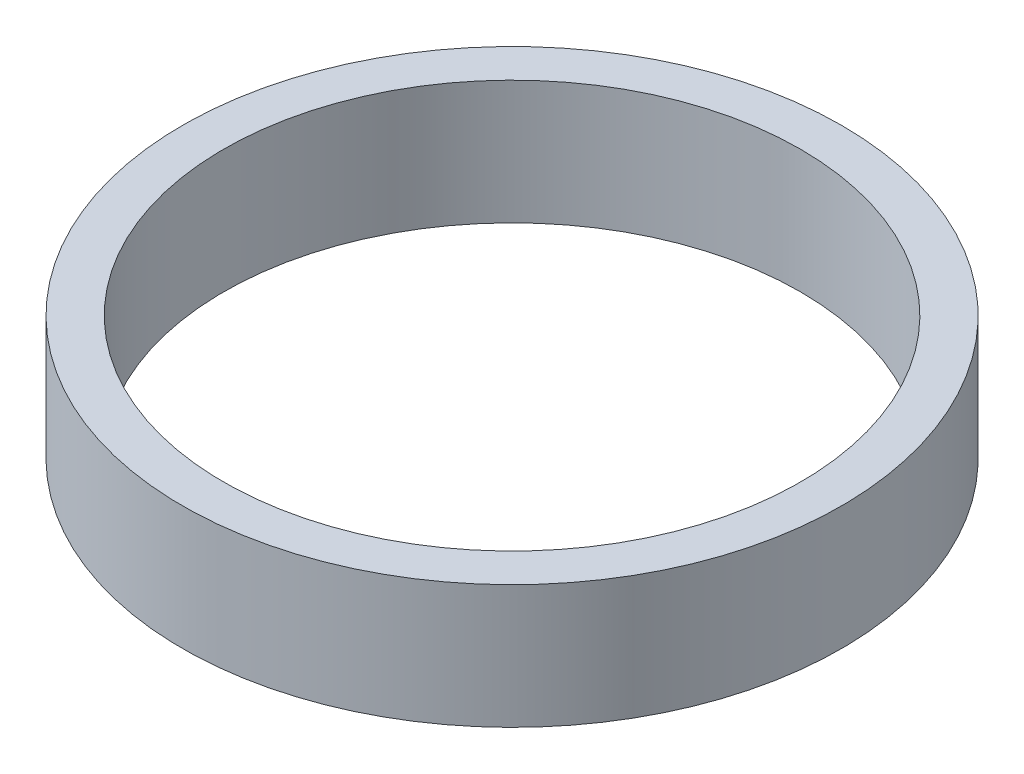
ISO-10303-21;
HEADER;
FILE_DESCRIPTION(('STEP AP214'),'2;1');
FILE_NAME('part.step','',(''),(''),'','','');
FILE_SCHEMA(('AUTOMOTIVE_DESIGN { 1 0 10303 214 1 1 1 1 }'));
ENDSEC;
DATA;
#1=APPLICATION_CONTEXT('core data for automotive mechanical design processes');
#2=APPLICATION_PROTOCOL_DEFINITION('international standard','automotive_design',2000,#1);
#3=PRODUCT_CONTEXT('',#1,'mechanical');
#4=PRODUCT('Part','Part','',(#3));
#5=PRODUCT_RELATED_PRODUCT_CATEGORY('part','',(#4));
#6=PRODUCT_DEFINITION_FORMATION('','',#4);
#7=PRODUCT_DEFINITION_CONTEXT('part definition',#1,'design');
#8=PRODUCT_DEFINITION('design','',#6,#7);
#9=PRODUCT_DEFINITION_SHAPE('','',#8);
#10=(LENGTH_UNIT() NAMED_UNIT(*) SI_UNIT(.MILLI.,.METRE.));
#11=(NAMED_UNIT(*) PLANE_ANGLE_UNIT() SI_UNIT($,.RADIAN.));
#12=(NAMED_UNIT(*) SI_UNIT($,.STERADIAN.) SOLID_ANGLE_UNIT());
#13=UNCERTAINTY_MEASURE_WITH_UNIT(LENGTH_MEASURE(1.E-05),#10,'distance_accuracy_value','');
#14=(GEOMETRIC_REPRESENTATION_CONTEXT(3) GLOBAL_UNCERTAINTY_ASSIGNED_CONTEXT((#13)) GLOBAL_UNIT_ASSIGNED_CONTEXT((#10,
#11,#12)) REPRESENTATION_CONTEXT('',''));
#15=CARTESIAN_POINT('',(0.,0.,0.));
#16=DIRECTION('',(0.,0.,1.));
#17=DIRECTION('',(1.,0.,0.));
#18=AXIS2_PLACEMENT_3D('',#15,#16,#17);
#19=CARTESIAN_POINT('',(0.,7.62,0.));
#20=DIRECTION('',(0.,1.,0.));
#21=DIRECTION('',(0.,0.,1.));
#22=AXIS2_PLACEMENT_3D('',#19,#20,#21);
#23=PLANE('',#22);
#24=CARTESIAN_POINT('',(0.,7.62,0.));
#25=DIRECTION('',(0.,1.,0.));
#26=DIRECTION('',(0.,0.,1.));
#27=AXIS2_PLACEMENT_3D('',#24,#25,#26);
#28=CIRCLE('',#27,20.32);
#29=CARTESIAN_POINT('',(0.,7.62,-20.32));
#30=VERTEX_POINT('',#29);
#31=EDGE_CURVE('E10',#30,#30,#28,.T.);
#32=ORIENTED_EDGE('',*,*,#31,.T.);
#33=EDGE_LOOP('',(#32));
#34=FACE_BOUND('',#33,.T.);
#35=CARTESIAN_POINT('',(0.,7.62,0.));
#36=DIRECTION('',(0.,1.,0.));
#37=DIRECTION('',(0.,0.,1.));
#38=AXIS2_PLACEMENT_3D('',#35,#36,#37);
#39=CIRCLE('',#38,17.78);
#40=CARTESIAN_POINT('',(0.,7.62,-17.78));
#41=VERTEX_POINT('',#40);
#42=EDGE_CURVE('E56',#41,#41,#39,.T.);
#43=ORIENTED_EDGE('',*,*,#42,.F.);
#44=EDGE_LOOP('',(#43));
#45=FACE_BOUND('',#44,.T.);
#46=ADVANCED_FACE('F43',(#34,#45),#23,.T.);
#47=CARTESIAN_POINT('',(0.,0.,0.));
#48=DIRECTION('',(0.,1.,0.));
#49=DIRECTION('',(0.,0.,1.));
#50=AXIS2_PLACEMENT_3D('',#47,#48,#49);
#51=PLANE('',#50);
#52=CARTESIAN_POINT('',(0.,0.,0.));
#53=DIRECTION('',(0.,1.,0.));
#54=DIRECTION('',(0.,0.,1.));
#55=AXIS2_PLACEMENT_3D('',#52,#53,#54);
#56=CIRCLE('',#55,20.32);
#57=CARTESIAN_POINT('',(0.,0.,-20.32));
#58=VERTEX_POINT('',#57);
#59=EDGE_CURVE('E47',#58,#58,#56,.T.);
#60=ORIENTED_EDGE('',*,*,#59,.F.);
#61=EDGE_LOOP('',(#60));
#62=FACE_BOUND('',#61,.T.);
#63=CARTESIAN_POINT('',(0.,0.,0.));
#64=DIRECTION('',(0.,1.,0.));
#65=DIRECTION('',(0.,0.,1.));
#66=AXIS2_PLACEMENT_3D('',#63,#64,#65);
#67=CIRCLE('',#66,17.78);
#68=CARTESIAN_POINT('',(0.,0.,-17.78));
#69=VERTEX_POINT('',#68);
#70=EDGE_CURVE('E58',#69,#69,#67,.T.);
#71=ORIENTED_EDGE('',*,*,#70,.T.);
#72=EDGE_LOOP('',(#71));
#73=FACE_BOUND('',#72,.T.);
#74=ADVANCED_FACE('F70',(#62,#73),#51,.F.);
#75=CARTESIAN_POINT('',(0.,7.62,0.));
#76=DIRECTION('',(0.,-1.,0.));
#77=DIRECTION('',(0.,0.,-1.));
#78=AXIS2_PLACEMENT_3D('',#75,#76,#77);
#79=CYLINDRICAL_SURFACE('',#78,20.32);
#80=CARTESIAN_POINT('',(0.,7.62,-20.32));
#81=CARTESIAN_POINT('',(0.,7.540625,-20.32));
#82=CARTESIAN_POINT('',(0.,7.46125,-20.32));
#83=CARTESIAN_POINT('',(0.,7.3025,-20.32));
#84=CARTESIAN_POINT('',(0.,7.223125,-20.32));
#85=CARTESIAN_POINT('',(0.,7.064375,-20.32));
#86=CARTESIAN_POINT('',(0.,6.985,-20.32));
#87=CARTESIAN_POINT('',(0.,6.82625,-20.32));
#88=CARTESIAN_POINT('',(0.,6.746875,-20.32));
#89=CARTESIAN_POINT('',(0.,6.588125,-20.32));
#90=CARTESIAN_POINT('',(0.,6.50875,-20.32));
#91=CARTESIAN_POINT('',(0.,6.35,-20.32));
#92=CARTESIAN_POINT('',(0.,6.270625,-20.32));
#93=CARTESIAN_POINT('',(0.,6.111875,-20.32));
#94=CARTESIAN_POINT('',(0.,6.0325,-20.32));
#95=CARTESIAN_POINT('',(0.,5.87375,-20.32));
#96=CARTESIAN_POINT('',(0.,5.794375,-20.32));
#97=CARTESIAN_POINT('',(0.,5.635625,-20.32));
#98=CARTESIAN_POINT('',(0.,5.55625,-20.32));
#99=CARTESIAN_POINT('',(0.,5.3975,-20.32));
#100=CARTESIAN_POINT('',(0.,5.318125,-20.32));
#101=CARTESIAN_POINT('',(0.,5.159375,-20.32));
#102=CARTESIAN_POINT('',(0.,5.08,-20.32));
#103=CARTESIAN_POINT('',(0.,4.92125,-20.32));
#104=CARTESIAN_POINT('',(0.,4.841875,-20.32));
#105=CARTESIAN_POINT('',(0.,4.683125,-20.32));
#106=CARTESIAN_POINT('',(0.,4.60375,-20.32));
#107=CARTESIAN_POINT('',(0.,4.445,-20.32));
#108=CARTESIAN_POINT('',(0.,4.365625,-20.32));
#109=CARTESIAN_POINT('',(0.,4.206875,-20.32));
#110=CARTESIAN_POINT('',(0.,4.1275,-20.32));
#111=CARTESIAN_POINT('',(0.,3.96875,-20.32));
#112=CARTESIAN_POINT('',(0.,3.889375,-20.32));
#113=CARTESIAN_POINT('',(0.,3.730625,-20.32));
#114=CARTESIAN_POINT('',(0.,3.65125,-20.32));
#115=CARTESIAN_POINT('',(0.,3.4925,-20.32));
#116=CARTESIAN_POINT('',(0.,3.413125,-20.32));
#117=CARTESIAN_POINT('',(0.,3.254375,-20.32));
#118=CARTESIAN_POINT('',(0.,3.175,-20.32));
#119=CARTESIAN_POINT('',(0.,3.01625,-20.32));
#120=CARTESIAN_POINT('',(0.,2.936875,-20.32));
#121=CARTESIAN_POINT('',(0.,2.778125,-20.32));
#122=CARTESIAN_POINT('',(0.,2.69875,-20.32));
#123=CARTESIAN_POINT('',(0.,2.54,-20.32));
#124=CARTESIAN_POINT('',(0.,2.460625,-20.32));
#125=CARTESIAN_POINT('',(0.,2.301875,-20.32));
#126=CARTESIAN_POINT('',(0.,2.2225,-20.32));
#127=CARTESIAN_POINT('',(0.,2.06375,-20.32));
#128=CARTESIAN_POINT('',(0.,1.984375,-20.32));
#129=CARTESIAN_POINT('',(0.,1.825625,-20.32));
#130=CARTESIAN_POINT('',(0.,1.74625,-20.32));
#131=CARTESIAN_POINT('',(0.,1.5875,-20.32));
#132=CARTESIAN_POINT('',(0.,1.508125,-20.32));
#133=CARTESIAN_POINT('',(0.,1.349375,-20.32));
#134=CARTESIAN_POINT('',(0.,1.27,-20.32));
#135=CARTESIAN_POINT('',(0.,1.11125,-20.32));
#136=CARTESIAN_POINT('',(0.,1.031875,-20.32));
#137=CARTESIAN_POINT('',(0.,0.873125,-20.32));
#138=CARTESIAN_POINT('',(0.,0.79375,-20.32));
#139=CARTESIAN_POINT('',(0.,0.635,-20.32));
#140=CARTESIAN_POINT('',(0.,0.555625,-20.32));
#141=CARTESIAN_POINT('',(0.,0.396875,-20.32));
#142=CARTESIAN_POINT('',(0.,0.3175,-20.32));
#143=CARTESIAN_POINT('',(0.,0.15875,-20.32));
#144=CARTESIAN_POINT('',(0.,0.0793749999999999,-20.32));
#145=CARTESIAN_POINT('',(0.,0.,-20.32));
#146=B_SPLINE_CURVE_WITH_KNOTS('',3,(#80,#81,#82,#83,#84,#85,#86,#87,#88,#89,#90,#91,#92,#93,
#94,#95,#96,#97,#98,#99,#100,#101,#102,#103,#104,#105,#106,#107,#108,#109,#110,#111,#112,#113,
#114,#115,#116,#117,#118,#119,#120,#121,#122,#123,#124,#125,#126,#127,#128,#129,#130,#131,#132,
#133,#134,#135,#136,#137,#138,#139,#140,#141,#142,#143,#144,#145),.UNSPECIFIED.,.F.,.F.,(4,2,2,
2,2,2,2,2,2,2,2,2,2,2,2,2,2,2,2,2,2,2,2,2,2,2,2,2,2,2,2,2,4),(0.,0.238125,0.47625,
0.714375000000001,0.9525,1.190625,1.42875,1.666875,1.905,2.143125,2.38125,2.619375,2.8575,
3.095625,3.33375,3.571875,3.81,4.048125,4.28625,4.524375,4.7625,5.000625,5.23875,5.476875,5.715,
5.953125,6.19125,6.429375,6.6675,6.905625,7.14375,7.381875,7.62),.UNSPECIFIED.);
#147=EDGE_CURVE('BSEAM45',#30,#58,#146,.T.);
#148=ORIENTED_EDGE('',*,*,#31,.F.);
#149=ORIENTED_EDGE('',*,*,#59,.T.);
#150=ORIENTED_EDGE('',*,*,#147,.T.);
#151=ORIENTED_EDGE('',*,*,#147,.F.);
#152=EDGE_LOOP('',(#148,#150,#149,#151));
#153=FACE_BOUND('',#152,.T.);
#154=ADVANCED_FACE('F45',(#153),#79,.T.);
#155=CARTESIAN_POINT('',(0.,7.62,0.));
#156=DIRECTION('',(0.,-1.,0.));
#157=DIRECTION('',(0.,0.,-1.));
#158=AXIS2_PLACEMENT_3D('',#155,#156,#157);
#159=CYLINDRICAL_SURFACE('',#158,17.78);
#160=CARTESIAN_POINT('',(0.,7.62,-17.78));
#161=CARTESIAN_POINT('',(0.,7.540625,-17.78));
#162=CARTESIAN_POINT('',(0.,7.46125,-17.78));
#163=CARTESIAN_POINT('',(0.,7.3025,-17.78));
#164=CARTESIAN_POINT('',(0.,7.223125,-17.78));
#165=CARTESIAN_POINT('',(0.,7.064375,-17.78));
#166=CARTESIAN_POINT('',(0.,6.985,-17.78));
#167=CARTESIAN_POINT('',(0.,6.82625,-17.78));
#168=CARTESIAN_POINT('',(0.,6.746875,-17.78));
#169=CARTESIAN_POINT('',(0.,6.588125,-17.78));
#170=CARTESIAN_POINT('',(0.,6.50875,-17.78));
#171=CARTESIAN_POINT('',(0.,6.35,-17.78));
#172=CARTESIAN_POINT('',(0.,6.270625,-17.78));
#173=CARTESIAN_POINT('',(0.,6.111875,-17.78));
#174=CARTESIAN_POINT('',(0.,6.0325,-17.78));
#175=CARTESIAN_POINT('',(0.,5.87375,-17.78));
#176=CARTESIAN_POINT('',(0.,5.794375,-17.78));
#177=CARTESIAN_POINT('',(0.,5.635625,-17.78));
#178=CARTESIAN_POINT('',(0.,5.55625,-17.78));
#179=CARTESIAN_POINT('',(0.,5.3975,-17.78));
#180=CARTESIAN_POINT('',(0.,5.318125,-17.78));
#181=CARTESIAN_POINT('',(0.,5.159375,-17.78));
#182=CARTESIAN_POINT('',(0.,5.08,-17.78));
#183=CARTESIAN_POINT('',(0.,4.92125,-17.78));
#184=CARTESIAN_POINT('',(0.,4.841875,-17.78));
#185=CARTESIAN_POINT('',(0.,4.683125,-17.78));
#186=CARTESIAN_POINT('',(0.,4.60375,-17.78));
#187=CARTESIAN_POINT('',(0.,4.445,-17.78));
#188=CARTESIAN_POINT('',(0.,4.365625,-17.78));
#189=CARTESIAN_POINT('',(0.,4.206875,-17.78));
#190=CARTESIAN_POINT('',(0.,4.1275,-17.78));
#191=CARTESIAN_POINT('',(0.,3.96875,-17.78));
#192=CARTESIAN_POINT('',(0.,3.889375,-17.78));
#193=CARTESIAN_POINT('',(0.,3.730625,-17.78));
#194=CARTESIAN_POINT('',(0.,3.65125,-17.78));
#195=CARTESIAN_POINT('',(0.,3.4925,-17.78));
#196=CARTESIAN_POINT('',(0.,3.413125,-17.78));
#197=CARTESIAN_POINT('',(0.,3.254375,-17.78));
#198=CARTESIAN_POINT('',(0.,3.175,-17.78));
#199=CARTESIAN_POINT('',(0.,3.01625,-17.78));
#200=CARTESIAN_POINT('',(0.,2.936875,-17.78));
#201=CARTESIAN_POINT('',(0.,2.778125,-17.78));
#202=CARTESIAN_POINT('',(0.,2.69875,-17.78));
#203=CARTESIAN_POINT('',(0.,2.54,-17.78));
#204=CARTESIAN_POINT('',(0.,2.460625,-17.78));
#205=CARTESIAN_POINT('',(0.,2.301875,-17.78));
#206=CARTESIAN_POINT('',(0.,2.2225,-17.78));
#207=CARTESIAN_POINT('',(0.,2.06375,-17.78));
#208=CARTESIAN_POINT('',(0.,1.984375,-17.78));
#209=CARTESIAN_POINT('',(0.,1.825625,-17.78));
#210=CARTESIAN_POINT('',(0.,1.74625,-17.78));
#211=CARTESIAN_POINT('',(0.,1.5875,-17.78));
#212=CARTESIAN_POINT('',(0.,1.508125,-17.78));
#213=CARTESIAN_POINT('',(0.,1.349375,-17.78));
#214=CARTESIAN_POINT('',(0.,1.27,-17.78));
#215=CARTESIAN_POINT('',(0.,1.11125,-17.78));
#216=CARTESIAN_POINT('',(0.,1.031875,-17.78));
#217=CARTESIAN_POINT('',(0.,0.873125,-17.78));
#218=CARTESIAN_POINT('',(0.,0.79375,-17.78));
#219=CARTESIAN_POINT('',(0.,0.635,-17.78));
#220=CARTESIAN_POINT('',(0.,0.555625,-17.78));
#221=CARTESIAN_POINT('',(0.,0.396875,-17.78));
#222=CARTESIAN_POINT('',(0.,0.3175,-17.78));
#223=CARTESIAN_POINT('',(0.,0.15875,-17.78));
#224=CARTESIAN_POINT('',(0.,0.0793749999999999,-17.78));
#225=CARTESIAN_POINT('',(0.,0.,-17.78));
#226=B_SPLINE_CURVE_WITH_KNOTS('',3,(#160,#161,#162,#163,#164,#165,#166,#167,#168,#169,#170,
#171,#172,#173,#174,#175,#176,#177,#178,#179,#180,#181,#182,#183,#184,#185,#186,#187,#188,#189,
#190,#191,#192,#193,#194,#195,#196,#197,#198,#199,#200,#201,#202,#203,#204,#205,#206,#207,#208,
#209,#210,#211,#212,#213,#214,#215,#216,#217,#218,#219,#220,#221,#222,#223,#224,#225),
.UNSPECIFIED.,.F.,.F.,(4,2,2,2,2,2,2,2,2,2,2,2,2,2,2,2,2,2,2,2,2,2,2,2,2,2,2,2,2,2,2,2,4),(0.,
0.238125,0.47625,0.714375000000001,0.9525,1.190625,1.42875,1.666875,1.905,2.143125,2.38125,
2.619375,2.8575,3.095625,3.33375,3.571875,3.81,4.048125,4.28625,4.524375,4.7625,5.000625,
5.23875,5.476875,5.715,5.953125,6.19125,6.429375,6.6675,6.905625,7.14375,7.381875,7.62),.UNSPECIFIED.);
#227=EDGE_CURVE('BSEAM66',#41,#69,#226,.T.);
#228=ORIENTED_EDGE('',*,*,#42,.T.);
#229=ORIENTED_EDGE('',*,*,#70,.F.);
#230=ORIENTED_EDGE('',*,*,#227,.T.);
#231=ORIENTED_EDGE('',*,*,#227,.F.);
#232=EDGE_LOOP('',(#228,#230,#229,#231));
#233=FACE_BOUND('',#232,.T.);
#234=ADVANCED_FACE('F66',(#233),#159,.F.);
#235=CLOSED_SHELL('',(#46,#74,#154,#234));
#236=MANIFOLD_SOLID_BREP('B2',#235);
#237=ADVANCED_BREP_SHAPE_REPRESENTATION('',(#18,#236),#14);
#238=SHAPE_DEFINITION_REPRESENTATION(#9,#237);
ENDSEC;
END-ISO-10303-21;
